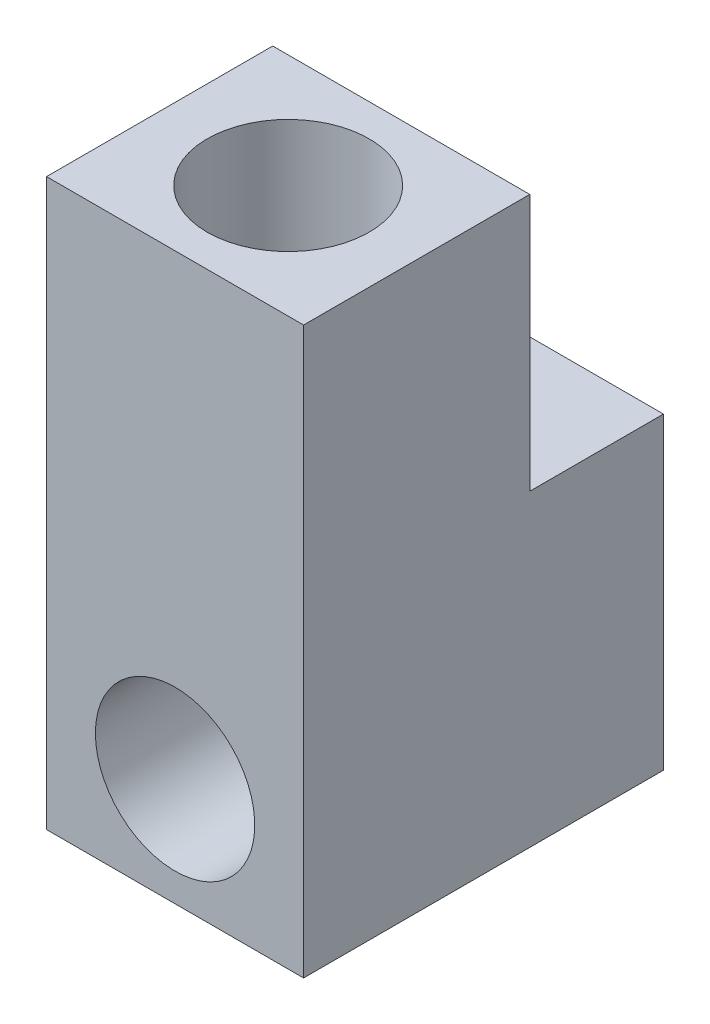
ISO-10303-21;
HEADER;
FILE_DESCRIPTION(('STEP AP214'),'2;1');
FILE_NAME('part.step','',(''),(''),'','','');
FILE_SCHEMA(('AUTOMOTIVE_DESIGN { 1 0 10303 214 1 1 1 1 }'));
ENDSEC;
DATA;
#1=APPLICATION_CONTEXT('core data for automotive mechanical design processes');
#2=APPLICATION_PROTOCOL_DEFINITION('international standard','automotive_design',2000,#1);
#3=PRODUCT_CONTEXT('',#1,'mechanical');
#4=PRODUCT('Part','Part','',(#3));
#5=PRODUCT_RELATED_PRODUCT_CATEGORY('part','',(#4));
#6=PRODUCT_DEFINITION_FORMATION('','',#4);
#7=PRODUCT_DEFINITION_CONTEXT('part definition',#1,'design');
#8=PRODUCT_DEFINITION('design','',#6,#7);
#9=PRODUCT_DEFINITION_SHAPE('','',#8);
#10=(LENGTH_UNIT() NAMED_UNIT(*) SI_UNIT(.MILLI.,.METRE.));
#11=(NAMED_UNIT(*) PLANE_ANGLE_UNIT() SI_UNIT($,.RADIAN.));
#12=(NAMED_UNIT(*) SI_UNIT($,.STERADIAN.) SOLID_ANGLE_UNIT());
#13=UNCERTAINTY_MEASURE_WITH_UNIT(LENGTH_MEASURE(1.E-05),#10,'distance_accuracy_value','');
#14=(GEOMETRIC_REPRESENTATION_CONTEXT(3) GLOBAL_UNCERTAINTY_ASSIGNED_CONTEXT((#13)) GLOBAL_UNIT_ASSIGNED_CONTEXT((#10,
#11,#12)) REPRESENTATION_CONTEXT('',''));
#15=CARTESIAN_POINT('',(0.,0.,0.));
#16=DIRECTION('',(0.,0.,1.));
#17=DIRECTION('',(1.,0.,0.));
#18=AXIS2_PLACEMENT_3D('',#15,#16,#17);
#19=CARTESIAN_POINT('',(-2.5,11.,-3.5));
#20=DIRECTION('',(0.,0.,1.));
#21=DIRECTION('',(1.,0.,0.));
#22=AXIS2_PLACEMENT_3D('',#19,#20,#21);
#23=PLANE('',#22);
#24=CARTESIAN_POINT('',(0.,2.1,-3.5));
#25=DIRECTION('',(0.,0.,-1.));
#26=DIRECTION('',(-1.,0.,0.));
#27=AXIS2_PLACEMENT_3D('',#24,#25,#26);
#28=CIRCLE('',#27,1.55);
#29=CARTESIAN_POINT('',(-1.55,2.1,-3.5));
#30=VERTEX_POINT('',#29);
#31=EDGE_CURVE('E162',#30,#30,#28,.T.);
#32=ORIENTED_EDGE('',*,*,#31,.F.);
#33=EDGE_LOOP('',(#32));
#34=FACE_BOUND('',#33,.T.);
#35=DIRECTION('',(-1.,0.,0.));
#36=VECTOR('',#35,1.);
#37=CARTESIAN_POINT('',(2.5,6.,-3.5));
#38=LINE('',#37,#36);
#39=CARTESIAN_POINT('',(2.5,6.,-3.5));
#40=VERTEX_POINT('',#39);
#41=CARTESIAN_POINT('',(-2.5,6.,-3.5));
#42=VERTEX_POINT('',#41);
#43=EDGE_CURVE('E135',#40,#42,#38,.T.);
#44=ORIENTED_EDGE('',*,*,#43,.F.);
#45=DIRECTION('',(0.,-1.,0.));
#46=VECTOR('',#45,1.);
#47=CARTESIAN_POINT('',(2.5,11.,-3.5));
#48=LINE('',#47,#46);
#49=CARTESIAN_POINT('',(2.5,0.,-3.5));
#50=VERTEX_POINT('',#49);
#51=EDGE_CURVE('E11',#40,#50,#48,.T.);
#52=ORIENTED_EDGE('',*,*,#51,.T.);
#53=DIRECTION('',(-1.,0.,0.));
#54=VECTOR('',#53,1.);
#55=CARTESIAN_POINT('',(-2.5,0.,-3.5));
#56=LINE('',#55,#54);
#57=CARTESIAN_POINT('',(-2.5,0.,-3.5));
#58=VERTEX_POINT('',#57);
#59=EDGE_CURVE('E107',#50,#58,#56,.T.);
#60=ORIENTED_EDGE('',*,*,#59,.T.);
#61=DIRECTION('',(0.,-1.,0.));
#62=VECTOR('',#61,1.);
#63=CARTESIAN_POINT('',(-2.5,11.,-3.5));
#64=LINE('',#63,#62);
#65=EDGE_CURVE('E48',#42,#58,#64,.T.);
#66=ORIENTED_EDGE('',*,*,#65,.F.);
#67=EDGE_LOOP('',(#44,#52,#60,#66));
#68=FACE_BOUND('',#67,.T.);
#69=ADVANCED_FACE('F39',(#34,#68),#23,.F.);
#70=CARTESIAN_POINT('',(2.5,11.,3.5));
#71=DIRECTION('',(-1.,0.,0.));
#72=DIRECTION('',(0.,0.,1.));
#73=AXIS2_PLACEMENT_3D('',#70,#71,#72);
#74=PLANE('',#73);
#75=DIRECTION('',(0.,0.,-1.));
#76=VECTOR('',#75,1.);
#77=CARTESIAN_POINT('',(2.5,6.,-0.9));
#78=LINE('',#77,#76);
#79=CARTESIAN_POINT('',(2.5,6.,-0.9));
#80=VERTEX_POINT('',#79);
#81=EDGE_CURVE('E138',#80,#40,#78,.T.);
#82=ORIENTED_EDGE('',*,*,#81,.F.);
#83=DIRECTION('',(0.,1.,0.));
#84=VECTOR('',#83,1.);
#85=CARTESIAN_POINT('',(2.5,6.,-0.9));
#86=LINE('',#85,#84);
#87=CARTESIAN_POINT('',(2.5,11.,-0.9));
#88=VERTEX_POINT('',#87);
#89=EDGE_CURVE('E151',#80,#88,#86,.T.);
#90=ORIENTED_EDGE('',*,*,#89,.T.);
#91=DIRECTION('',(0.,0.,-1.));
#92=VECTOR('',#91,1.);
#93=CARTESIAN_POINT('',(2.5,11.,3.5));
#94=LINE('',#93,#92);
#95=CARTESIAN_POINT('',(2.5,11.,3.5));
#96=VERTEX_POINT('',#95);
#97=EDGE_CURVE('E93',#96,#88,#94,.T.);
#98=ORIENTED_EDGE('',*,*,#97,.F.);
#99=DIRECTION('',(0.,-1.,0.));
#100=VECTOR('',#99,1.);
#101=CARTESIAN_POINT('',(2.5,11.,3.5));
#102=LINE('',#101,#100);
#103=CARTESIAN_POINT('',(2.5,0.,3.5));
#104=VERTEX_POINT('',#103);
#105=EDGE_CURVE('E85',#96,#104,#102,.T.);
#106=ORIENTED_EDGE('',*,*,#105,.T.);
#107=DIRECTION('',(0.,0.,-1.));
#108=VECTOR('',#107,1.);
#109=CARTESIAN_POINT('',(2.5,0.,3.5));
#110=LINE('',#109,#108);
#111=EDGE_CURVE('E100',#104,#50,#110,.T.);
#112=ORIENTED_EDGE('',*,*,#111,.T.);
#113=ORIENTED_EDGE('',*,*,#51,.F.);
#114=EDGE_LOOP('',(#82,#90,#98,#106,#112,#113));
#115=FACE_BOUND('',#114,.T.);
#116=ADVANCED_FACE('F41',(#115),#74,.F.);
#117=CARTESIAN_POINT('',(-2.5,11.,3.5));
#118=DIRECTION('',(1.,0.,0.));
#119=DIRECTION('',(0.,0.,-1.));
#120=AXIS2_PLACEMENT_3D('',#117,#118,#119);
#121=PLANE('',#120);
#122=DIRECTION('',(0.,0.,1.));
#123=VECTOR('',#122,1.);
#124=CARTESIAN_POINT('',(-2.5,11.,3.5));
#125=LINE('',#124,#123);
#126=CARTESIAN_POINT('',(-2.5,11.,-0.9));
#127=VERTEX_POINT('',#126);
#128=CARTESIAN_POINT('',(-2.5,11.,3.5));
#129=VERTEX_POINT('',#128);
#130=EDGE_CURVE('E157',#127,#129,#125,.T.);
#131=ORIENTED_EDGE('',*,*,#130,.F.);
#132=DIRECTION('',(0.,1.,0.));
#133=VECTOR('',#132,1.);
#134=CARTESIAN_POINT('',(-2.5,6.,-0.9));
#135=LINE('',#134,#133);
#136=CARTESIAN_POINT('',(-2.5,6.,-0.9));
#137=VERTEX_POINT('',#136);
#138=EDGE_CURVE('E55',#137,#127,#135,.T.);
#139=ORIENTED_EDGE('',*,*,#138,.F.);
#140=DIRECTION('',(0.,0.,1.));
#141=VECTOR('',#140,1.);
#142=CARTESIAN_POINT('',(-2.5,6.,-3.5));
#143=LINE('',#142,#141);
#144=EDGE_CURVE('E131',#42,#137,#143,.T.);
#145=ORIENTED_EDGE('',*,*,#144,.F.);
#146=ORIENTED_EDGE('',*,*,#65,.T.);
#147=DIRECTION('',(0.,0.,1.));
#148=VECTOR('',#147,1.);
#149=CARTESIAN_POINT('',(-2.5,0.,3.5));
#150=LINE('',#149,#148);
#151=CARTESIAN_POINT('',(-2.5,0.,3.5));
#152=VERTEX_POINT('',#151);
#153=EDGE_CURVE('E94',#58,#152,#150,.T.);
#154=ORIENTED_EDGE('',*,*,#153,.T.);
#155=DIRECTION('',(0.,-1.,0.));
#156=VECTOR('',#155,1.);
#157=CARTESIAN_POINT('',(-2.5,11.,3.5));
#158=LINE('',#157,#156);
#159=EDGE_CURVE('E88',#129,#152,#158,.T.);
#160=ORIENTED_EDGE('',*,*,#159,.F.);
#161=EDGE_LOOP('',(#131,#139,#145,#146,#154,#160));
#162=FACE_BOUND('',#161,.T.);
#163=ADVANCED_FACE('F128',(#162),#121,.F.);
#164=CARTESIAN_POINT('',(-2.5,11.,3.5));
#165=DIRECTION('',(0.,0.,-1.));
#166=DIRECTION('',(-1.,0.,0.));
#167=AXIS2_PLACEMENT_3D('',#164,#165,#166);
#168=PLANE('',#167);
#169=CARTESIAN_POINT('',(0.,2.1,3.5));
#170=DIRECTION('',(0.,0.,-1.));
#171=DIRECTION('',(-1.,0.,0.));
#172=AXIS2_PLACEMENT_3D('',#169,#170,#171);
#173=CIRCLE('',#172,1.55);
#174=CARTESIAN_POINT('',(-1.55,2.1,3.5));
#175=VERTEX_POINT('',#174);
#176=EDGE_CURVE('E167',#175,#175,#173,.T.);
#177=ORIENTED_EDGE('',*,*,#176,.T.);
#178=EDGE_LOOP('',(#177));
#179=FACE_BOUND('',#178,.T.);
#180=DIRECTION('',(1.,0.,0.));
#181=VECTOR('',#180,1.);
#182=CARTESIAN_POINT('',(-2.5,0.,3.5));
#183=LINE('',#182,#181);
#184=EDGE_CURVE('E82',#152,#104,#183,.T.);
#185=ORIENTED_EDGE('',*,*,#184,.T.);
#186=ORIENTED_EDGE('',*,*,#105,.F.);
#187=DIRECTION('',(1.,0.,0.));
#188=VECTOR('',#187,1.);
#189=CARTESIAN_POINT('',(-2.5,11.,3.5));
#190=LINE('',#189,#188);
#191=EDGE_CURVE('E64',#129,#96,#190,.T.);
#192=ORIENTED_EDGE('',*,*,#191,.F.);
#193=ORIENTED_EDGE('',*,*,#159,.T.);
#194=EDGE_LOOP('',(#185,#186,#192,#193));
#195=FACE_BOUND('',#194,.T.);
#196=ADVANCED_FACE('F84',(#179,#195),#168,.F.);
#197=CARTESIAN_POINT('',(0.,11.,0.));
#198=DIRECTION('',(0.,-1.,0.));
#199=DIRECTION('',(0.,0.,-1.));
#200=AXIS2_PLACEMENT_3D('',#197,#198,#199);
#201=PLANE('',#200);
#202=CARTESIAN_POINT('',(0.,11.,1.3));
#203=DIRECTION('',(0.,1.,0.));
#204=DIRECTION('',(0.,0.,1.));
#205=AXIS2_PLACEMENT_3D('',#202,#203,#204);
#206=CIRCLE('',#205,1.575);
#207=CARTESIAN_POINT('',(0.,11.,2.875));
#208=VERTEX_POINT('',#207);
#209=EDGE_CURVE('E115',#208,#208,#206,.T.);
#210=ORIENTED_EDGE('',*,*,#209,.F.);
#211=EDGE_LOOP('',(#210));
#212=FACE_BOUND('',#211,.T.);
#213=ORIENTED_EDGE('',*,*,#97,.T.);
#214=DIRECTION('',(1.,0.,0.));
#215=VECTOR('',#214,1.);
#216=CARTESIAN_POINT('',(-2.5,11.,-0.9));
#217=LINE('',#216,#215);
#218=EDGE_CURVE('E147',#127,#88,#217,.T.);
#219=ORIENTED_EDGE('',*,*,#218,.F.);
#220=ORIENTED_EDGE('',*,*,#130,.T.);
#221=ORIENTED_EDGE('',*,*,#191,.T.);
#222=EDGE_LOOP('',(#213,#219,#220,#221));
#223=FACE_BOUND('',#222,.T.);
#224=ADVANCED_FACE('F180',(#212,#223),#201,.F.);
#225=CARTESIAN_POINT('',(0.,0.,0.));
#226=DIRECTION('',(0.,-1.,0.));
#227=DIRECTION('',(0.,0.,-1.));
#228=AXIS2_PLACEMENT_3D('',#225,#226,#227);
#229=PLANE('',#228);
#230=ORIENTED_EDGE('',*,*,#111,.F.);
#231=ORIENTED_EDGE('',*,*,#184,.F.);
#232=ORIENTED_EDGE('',*,*,#153,.F.);
#233=ORIENTED_EDGE('',*,*,#59,.F.);
#234=EDGE_LOOP('',(#230,#231,#232,#233));
#235=FACE_BOUND('',#234,.T.);
#236=ADVANCED_FACE('F105',(#235),#229,.T.);
#237=CARTESIAN_POINT('',(0.,4.,1.3));
#238=DIRECTION('',(0.,1.,0.));
#239=DIRECTION('',(0.,0.,1.));
#240=AXIS2_PLACEMENT_3D('',#237,#238,#239);
#241=CYLINDRICAL_SURFACE('',#240,1.575);
#242=CARTESIAN_POINT('',(0.,4.,1.3));
#243=DIRECTION('',(0.,1.,0.));
#244=DIRECTION('',(0.,0.,1.));
#245=AXIS2_PLACEMENT_3D('',#242,#243,#244);
#246=CIRCLE('',#245,1.575);
#247=CARTESIAN_POINT('',(0.,4.,2.875));
#248=VERTEX_POINT('',#247);
#249=EDGE_CURVE('E109',#248,#248,#246,.T.);
#250=ORIENTED_EDGE('',*,*,#249,.F.);
#251=EDGE_LOOP('',(#250));
#252=FACE_BOUND('',#251,.T.);
#253=ORIENTED_EDGE('',*,*,#209,.T.);
#254=EDGE_LOOP('',(#253));
#255=FACE_BOUND('',#254,.T.);
#256=ADVANCED_FACE('F191',(#252,#255),#241,.F.);
#257=CARTESIAN_POINT('',(0.,4.,1.3));
#258=DIRECTION('',(0.,1.,0.));
#259=DIRECTION('',(0.,0.,1.));
#260=AXIS2_PLACEMENT_3D('',#257,#258,#259);
#261=PLANE('',#260);
#262=ORIENTED_EDGE('',*,*,#249,.T.);
#263=EDGE_LOOP('',(#262));
#264=FACE_BOUND('',#263,.T.);
#265=ADVANCED_FACE('F220',(#264),#261,.T.);
#266=CARTESIAN_POINT('',(0.,2.1,3.5));
#267=DIRECTION('',(0.,0.,-1.));
#268=DIRECTION('',(-1.,0.,0.));
#269=AXIS2_PLACEMENT_3D('',#266,#267,#268);
#270=CYLINDRICAL_SURFACE('',#269,1.55);
#271=ORIENTED_EDGE('',*,*,#176,.F.);
#272=EDGE_LOOP('',(#271));
#273=FACE_BOUND('',#272,.T.);
#274=ORIENTED_EDGE('',*,*,#31,.T.);
#275=EDGE_LOOP('',(#274));
#276=FACE_BOUND('',#275,.T.);
#277=ADVANCED_FACE('F225',(#273,#276),#270,.F.);
#278=CARTESIAN_POINT('',(-2.5,6.,-0.9));
#279=DIRECTION('',(0.,0.,1.));
#280=DIRECTION('',(1.,0.,0.));
#281=AXIS2_PLACEMENT_3D('',#278,#279,#280);
#282=PLANE('',#281);
#283=ORIENTED_EDGE('',*,*,#218,.T.);
#284=ORIENTED_EDGE('',*,*,#89,.F.);
#285=DIRECTION('',(1.,0.,0.));
#286=VECTOR('',#285,1.);
#287=CARTESIAN_POINT('',(-2.5,6.,-0.9));
#288=LINE('',#287,#286);
#289=EDGE_CURVE('E149',#137,#80,#288,.T.);
#290=ORIENTED_EDGE('',*,*,#289,.F.);
#291=ORIENTED_EDGE('',*,*,#138,.T.);
#292=EDGE_LOOP('',(#283,#284,#290,#291));
#293=FACE_BOUND('',#292,.T.);
#294=ADVANCED_FACE('F150',(#293),#282,.F.);
#295=CARTESIAN_POINT('',(0.,6.,0.));
#296=DIRECTION('',(0.,1.,0.));
#297=DIRECTION('',(0.,0.,1.));
#298=AXIS2_PLACEMENT_3D('',#295,#296,#297);
#299=PLANE('',#298);
#300=ORIENTED_EDGE('',*,*,#43,.T.);
#301=ORIENTED_EDGE('',*,*,#144,.T.);
#302=ORIENTED_EDGE('',*,*,#289,.T.);
#303=ORIENTED_EDGE('',*,*,#81,.T.);
#304=EDGE_LOOP('',(#300,#301,#302,#303));
#305=FACE_BOUND('',#304,.T.);
#306=ADVANCED_FACE('F154',(#305),#299,.T.);
#307=CLOSED_SHELL('',(#69,#116,#163,#196,#224,#236,#256,#265,#277,#294,#306));
#308=MANIFOLD_SOLID_BREP('B2',#307);
#309=ADVANCED_BREP_SHAPE_REPRESENTATION('',(#18,#308),#14);
#310=SHAPE_DEFINITION_REPRESENTATION(#9,#309);
ENDSEC;
END-ISO-10303-21;
